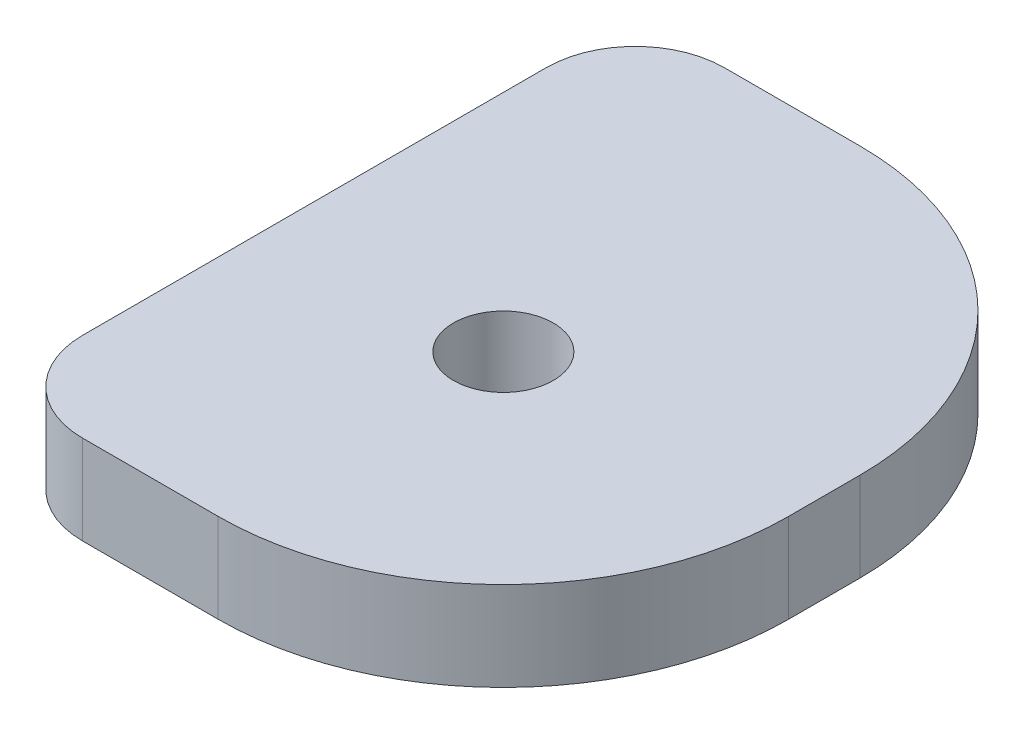
ISO-10303-21;
HEADER;
FILE_DESCRIPTION(('STEP AP214'),'2;1');
FILE_NAME('part.step','',(''),(''),'','','');
FILE_SCHEMA(('AUTOMOTIVE_DESIGN { 1 0 10303 214 1 1 1 1 }'));
ENDSEC;
DATA;
#1=APPLICATION_CONTEXT('core data for automotive mechanical design processes');
#2=APPLICATION_PROTOCOL_DEFINITION('international standard','automotive_design',2000,#1);
#3=PRODUCT_CONTEXT('',#1,'mechanical');
#4=PRODUCT('Part','Part','',(#3));
#5=PRODUCT_RELATED_PRODUCT_CATEGORY('part','',(#4));
#6=PRODUCT_DEFINITION_FORMATION('','',#4);
#7=PRODUCT_DEFINITION_CONTEXT('part definition',#1,'design');
#8=PRODUCT_DEFINITION('design','',#6,#7);
#9=PRODUCT_DEFINITION_SHAPE('','',#8);
#10=(LENGTH_UNIT() NAMED_UNIT(*) SI_UNIT(.MILLI.,.METRE.));
#11=(NAMED_UNIT(*) PLANE_ANGLE_UNIT() SI_UNIT($,.RADIAN.));
#12=(NAMED_UNIT(*) SI_UNIT($,.STERADIAN.) SOLID_ANGLE_UNIT());
#13=UNCERTAINTY_MEASURE_WITH_UNIT(LENGTH_MEASURE(1.E-05),#10,'distance_accuracy_value','');
#14=(GEOMETRIC_REPRESENTATION_CONTEXT(3) GLOBAL_UNCERTAINTY_ASSIGNED_CONTEXT((#13)) GLOBAL_UNIT_ASSIGNED_CONTEXT((#10,
#11,#12)) REPRESENTATION_CONTEXT('',''));
#15=CARTESIAN_POINT('',(0.,0.,0.));
#16=DIRECTION('',(0.,0.,1.));
#17=DIRECTION('',(1.,0.,0.));
#18=AXIS2_PLACEMENT_3D('',#15,#16,#17);
#19=CARTESIAN_POINT('',(-25.4,3.175,11.43));
#20=DIRECTION('',(0.,0.,-1.));
#21=DIRECTION('',(-1.,0.,0.));
#22=AXIS2_PLACEMENT_3D('',#19,#20,#21);
#23=PLANE('',#22);
#24=DIRECTION('',(1.,0.,0.));
#25=VECTOR('',#24,1.);
#26=CARTESIAN_POINT('',(-25.4,3.175,11.43));
#27=LINE('',#26,#25);
#28=CARTESIAN_POINT('',(10.414,3.175,11.43));
#29=VERTEX_POINT('',#28);
#30=CARTESIAN_POINT('',(15.24,3.175,11.43));
#31=VERTEX_POINT('',#30);
#32=EDGE_CURVE('E164',#29,#31,#27,.T.);
#33=ORIENTED_EDGE('',*,*,#32,.F.);
#34=DIRECTION('',(0.,1.,0.));
#35=VECTOR('',#34,1.);
#36=CARTESIAN_POINT('',(10.414,3.175,11.43));
#37=LINE('',#36,#35);
#38=CARTESIAN_POINT('',(10.414,0.,11.43));
#39=VERTEX_POINT('',#38);
#40=EDGE_CURVE('E55',#29,#39,#37,.F.);
#41=ORIENTED_EDGE('',*,*,#40,.T.);
#42=DIRECTION('',(1.,0.,0.));
#43=VECTOR('',#42,1.);
#44=CARTESIAN_POINT('',(-25.4,0.,11.43));
#45=LINE('',#44,#43);
#46=CARTESIAN_POINT('',(15.24,0.,11.43));
#47=VERTEX_POINT('',#46);
#48=EDGE_CURVE('E98',#39,#47,#45,.T.);
#49=ORIENTED_EDGE('',*,*,#48,.T.);
#50=DIRECTION('',(0.,-1.,0.));
#51=VECTOR('',#50,1.);
#52=CARTESIAN_POINT('',(15.24,3.175,11.43));
#53=LINE('',#52,#51);
#54=EDGE_CURVE('E101',#47,#31,#53,.F.);
#55=ORIENTED_EDGE('',*,*,#54,.T.);
#56=EDGE_LOOP('',(#33,#41,#49,#55));
#57=FACE_BOUND('',#56,.T.);
#58=ADVANCED_FACE('F32',(#57),#23,.F.);
#59=CARTESIAN_POINT('',(25.4,3.175,-11.43));
#60=DIRECTION('',(-1.,0.,0.));
#61=DIRECTION('',(0.,0.,1.));
#62=AXIS2_PLACEMENT_3D('',#59,#60,#61);
#63=PLANE('',#62);
#64=DIRECTION('',(0.,0.,-1.));
#65=VECTOR('',#64,1.);
#66=CARTESIAN_POINT('',(25.4,0.,-11.43));
#67=LINE('',#66,#65);
#68=CARTESIAN_POINT('',(25.4,0.,1.27));
#69=VERTEX_POINT('',#68);
#70=CARTESIAN_POINT('',(25.4,0.,-1.27));
#71=VERTEX_POINT('',#70);
#72=EDGE_CURVE('E104',#69,#71,#67,.T.);
#73=ORIENTED_EDGE('',*,*,#72,.T.);
#74=DIRECTION('',(0.,-1.,0.));
#75=VECTOR('',#74,1.);
#76=CARTESIAN_POINT('',(25.4,3.175,-1.27));
#77=LINE('',#76,#75);
#78=CARTESIAN_POINT('',(25.4,3.175,-1.27));
#79=VERTEX_POINT('',#78);
#80=EDGE_CURVE('E136',#71,#79,#77,.F.);
#81=ORIENTED_EDGE('',*,*,#80,.T.);
#82=DIRECTION('',(0.,0.,-1.));
#83=VECTOR('',#82,1.);
#84=CARTESIAN_POINT('',(25.4,3.175,-11.43));
#85=LINE('',#84,#83);
#86=CARTESIAN_POINT('',(25.4,3.175,1.27));
#87=VERTEX_POINT('',#86);
#88=EDGE_CURVE('E120',#87,#79,#85,.T.);
#89=ORIENTED_EDGE('',*,*,#88,.F.);
#90=DIRECTION('',(0.,-1.,0.));
#91=VECTOR('',#90,1.);
#92=CARTESIAN_POINT('',(25.4,3.175,1.27));
#93=LINE('',#92,#91);
#94=EDGE_CURVE('E127',#87,#69,#93,.T.);
#95=ORIENTED_EDGE('',*,*,#94,.T.);
#96=EDGE_LOOP('',(#73,#81,#89,#95));
#97=FACE_BOUND('',#96,.T.);
#98=ADVANCED_FACE('F172',(#97),#63,.F.);
#99=CARTESIAN_POINT('',(-25.4,3.175,-11.43));
#100=DIRECTION('',(0.,0.,1.));
#101=DIRECTION('',(1.,0.,0.));
#102=AXIS2_PLACEMENT_3D('',#99,#100,#101);
#103=PLANE('',#102);
#104=DIRECTION('',(-1.,0.,0.));
#105=VECTOR('',#104,1.);
#106=CARTESIAN_POINT('',(-25.4,0.,-11.43));
#107=LINE('',#106,#105);
#108=CARTESIAN_POINT('',(15.24,0.,-11.43));
#109=VERTEX_POINT('',#108);
#110=CARTESIAN_POINT('',(10.414,0.,-11.43));
#111=VERTEX_POINT('',#110);
#112=EDGE_CURVE('E123',#109,#111,#107,.T.);
#113=ORIENTED_EDGE('',*,*,#112,.T.);
#114=DIRECTION('',(0.,1.,0.));
#115=VECTOR('',#114,1.);
#116=CARTESIAN_POINT('',(10.414,3.175,-11.43));
#117=LINE('',#116,#115);
#118=CARTESIAN_POINT('',(10.414,3.175,-11.43));
#119=VERTEX_POINT('',#118);
#120=EDGE_CURVE('E11',#111,#119,#117,.T.);
#121=ORIENTED_EDGE('',*,*,#120,.T.);
#122=DIRECTION('',(-1.,0.,0.));
#123=VECTOR('',#122,1.);
#124=CARTESIAN_POINT('',(-25.4,3.175,-11.43));
#125=LINE('',#124,#123);
#126=CARTESIAN_POINT('',(15.24,3.175,-11.43));
#127=VERTEX_POINT('',#126);
#128=EDGE_CURVE('E117',#127,#119,#125,.T.);
#129=ORIENTED_EDGE('',*,*,#128,.F.);
#130=DIRECTION('',(0.,-1.,0.));
#131=VECTOR('',#130,1.);
#132=CARTESIAN_POINT('',(15.24,3.175,-11.43));
#133=LINE('',#132,#131);
#134=EDGE_CURVE('E131',#127,#109,#133,.T.);
#135=ORIENTED_EDGE('',*,*,#134,.T.);
#136=EDGE_LOOP('',(#113,#121,#129,#135));
#137=FACE_BOUND('',#136,.T.);
#138=ADVANCED_FACE('F180',(#137),#103,.F.);
#139=CARTESIAN_POINT('',(0.,3.175,0.));
#140=DIRECTION('',(0.,1.,0.));
#141=DIRECTION('',(0.,0.,1.));
#142=AXIS2_PLACEMENT_3D('',#139,#140,#141);
#143=PLANE('',#142);
#144=DIRECTION('',(0.,0.,-1.));
#145=VECTOR('',#144,1.);
#146=CARTESIAN_POINT('',(7.23899999999999,3.175,-11.43));
#147=LINE('',#146,#145);
#148=CARTESIAN_POINT('',(7.239,3.175,8.255));
#149=VERTEX_POINT('',#148);
#150=CARTESIAN_POINT('',(7.23899999999999,3.175,-8.255));
#151=VERTEX_POINT('',#150);
#152=EDGE_CURVE('E158',#149,#151,#147,.T.);
#153=ORIENTED_EDGE('',*,*,#152,.F.);
#154=CARTESIAN_POINT('',(10.414,3.175,8.255));
#155=DIRECTION('',(0.,1.,0.));
#156=DIRECTION('',(0.,0.,1.));
#157=AXIS2_PLACEMENT_3D('',#154,#155,#156);
#158=CIRCLE('',#157,3.175);
#159=EDGE_CURVE('E145',#149,#29,#158,.T.);
#160=ORIENTED_EDGE('',*,*,#159,.T.);
#161=ORIENTED_EDGE('',*,*,#32,.T.);
#162=CARTESIAN_POINT('',(15.24,3.175,1.27));
#163=DIRECTION('',(0.,1.,0.));
#164=DIRECTION('',(0.,0.,1.));
#165=AXIS2_PLACEMENT_3D('',#162,#163,#164);
#166=CIRCLE('',#165,10.16);
#167=EDGE_CURVE('E114',#31,#87,#166,.T.);
#168=ORIENTED_EDGE('',*,*,#167,.T.);
#169=ORIENTED_EDGE('',*,*,#88,.T.);
#170=CARTESIAN_POINT('',(15.24,3.175,-1.27));
#171=DIRECTION('',(0.,1.,0.));
#172=DIRECTION('',(0.,0.,1.));
#173=AXIS2_PLACEMENT_3D('',#170,#171,#172);
#174=CIRCLE('',#173,10.16);
#175=EDGE_CURVE('E134',#79,#127,#174,.T.);
#176=ORIENTED_EDGE('',*,*,#175,.T.);
#177=ORIENTED_EDGE('',*,*,#128,.T.);
#178=CARTESIAN_POINT('',(10.414,3.175,-8.255));
#179=DIRECTION('',(0.,1.,0.));
#180=DIRECTION('',(0.,0.,1.));
#181=AXIS2_PLACEMENT_3D('',#178,#179,#180);
#182=CIRCLE('',#181,3.175);
#183=EDGE_CURVE('E143',#119,#151,#182,.T.);
#184=ORIENTED_EDGE('',*,*,#183,.T.);
#185=EDGE_LOOP('',(#153,#160,#161,#168,#169,#176,#177,#184));
#186=FACE_BOUND('',#185,.T.);
#187=CARTESIAN_POINT('',(15.24,3.175,1.27));
#188=DIRECTION('',(0.,1.,0.));
#189=DIRECTION('',(0.,0.,1.));
#190=AXIS2_PLACEMENT_3D('',#187,#188,#189);
#191=CIRCLE('',#190,1.778);
#192=CARTESIAN_POINT('',(15.24,3.175,3.048));
#193=VERTEX_POINT('',#192);
#194=EDGE_CURVE('E157',#193,#193,#191,.T.);
#195=ORIENTED_EDGE('',*,*,#194,.F.);
#196=EDGE_LOOP('',(#195));
#197=FACE_BOUND('',#196,.T.);
#198=ADVANCED_FACE('F162',(#186,#197),#143,.T.);
#199=CARTESIAN_POINT('',(0.,0.,0.));
#200=DIRECTION('',(0.,1.,0.));
#201=DIRECTION('',(0.,0.,1.));
#202=AXIS2_PLACEMENT_3D('',#199,#200,#201);
#203=PLANE('',#202);
#204=CARTESIAN_POINT('',(15.24,0.,1.27));
#205=DIRECTION('',(0.,1.,0.));
#206=DIRECTION('',(0.,0.,1.));
#207=AXIS2_PLACEMENT_3D('',#204,#205,#206);
#208=CIRCLE('',#207,1.778);
#209=CARTESIAN_POINT('',(15.24,0.,3.048));
#210=VERTEX_POINT('',#209);
#211=EDGE_CURVE('E105',#210,#210,#208,.T.);
#212=ORIENTED_EDGE('',*,*,#211,.T.);
#213=EDGE_LOOP('',(#212));
#214=FACE_BOUND('',#213,.T.);
#215=ORIENTED_EDGE('',*,*,#48,.F.);
#216=CARTESIAN_POINT('',(10.414,0.,8.255));
#217=DIRECTION('',(0.,1.,0.));
#218=DIRECTION('',(0.,0.,1.));
#219=AXIS2_PLACEMENT_3D('',#216,#217,#218);
#220=CIRCLE('',#219,3.175);
#221=CARTESIAN_POINT('',(7.239,0.,8.255));
#222=VERTEX_POINT('',#221);
#223=EDGE_CURVE('E40',#39,#222,#220,.F.);
#224=ORIENTED_EDGE('',*,*,#223,.T.);
#225=DIRECTION('',(0.,0.,-1.));
#226=VECTOR('',#225,1.);
#227=CARTESIAN_POINT('',(7.23899999999999,0.,-11.43));
#228=LINE('',#227,#226);
#229=CARTESIAN_POINT('',(7.23899999999999,0.,-8.255));
#230=VERTEX_POINT('',#229);
#231=EDGE_CURVE('E149',#222,#230,#228,.T.);
#232=ORIENTED_EDGE('',*,*,#231,.T.);
#233=CARTESIAN_POINT('',(10.414,0.,-8.255));
#234=DIRECTION('',(0.,1.,0.));
#235=DIRECTION('',(0.,0.,1.));
#236=AXIS2_PLACEMENT_3D('',#233,#234,#235);
#237=CIRCLE('',#236,3.175);
#238=EDGE_CURVE('E47',#230,#111,#237,.F.);
#239=ORIENTED_EDGE('',*,*,#238,.T.);
#240=ORIENTED_EDGE('',*,*,#112,.F.);
#241=CARTESIAN_POINT('',(15.24,0.,-1.27));
#242=DIRECTION('',(0.,1.,0.));
#243=DIRECTION('',(0.,0.,1.));
#244=AXIS2_PLACEMENT_3D('',#241,#242,#243);
#245=CIRCLE('',#244,10.16);
#246=EDGE_CURVE('E129',#109,#71,#245,.F.);
#247=ORIENTED_EDGE('',*,*,#246,.T.);
#248=ORIENTED_EDGE('',*,*,#72,.F.);
#249=CARTESIAN_POINT('',(15.24,0.,1.27));
#250=DIRECTION('',(0.,1.,0.));
#251=DIRECTION('',(0.,0.,1.));
#252=AXIS2_PLACEMENT_3D('',#249,#250,#251);
#253=CIRCLE('',#252,10.16);
#254=EDGE_CURVE('E108',#69,#47,#253,.F.);
#255=ORIENTED_EDGE('',*,*,#254,.T.);
#256=EDGE_LOOP('',(#215,#224,#232,#239,#240,#247,#248,#255));
#257=FACE_BOUND('',#256,.T.);
#258=ADVANCED_FACE('F109',(#214,#257),#203,.F.);
#259=CARTESIAN_POINT('',(15.24,3.175,1.27));
#260=DIRECTION('',(0.,-1.,0.));
#261=DIRECTION('',(0.,0.,-1.));
#262=AXIS2_PLACEMENT_3D('',#259,#260,#261);
#263=CYLINDRICAL_SURFACE('',#262,10.16);
#264=ORIENTED_EDGE('',*,*,#167,.F.);
#265=ORIENTED_EDGE('',*,*,#54,.F.);
#266=ORIENTED_EDGE('',*,*,#254,.F.);
#267=ORIENTED_EDGE('',*,*,#94,.F.);
#268=EDGE_LOOP('',(#264,#265,#266,#267));
#269=FACE_BOUND('',#268,.T.);
#270=ADVANCED_FACE('F116',(#269),#263,.T.);
#271=CARTESIAN_POINT('',(15.24,0.,1.27));
#272=DIRECTION('',(0.,1.,0.));
#273=DIRECTION('',(0.,0.,1.));
#274=AXIS2_PLACEMENT_3D('',#271,#272,#273);
#275=CYLINDRICAL_SURFACE('',#274,1.778);
#276=ORIENTED_EDGE('',*,*,#211,.F.);
#277=EDGE_LOOP('',(#276));
#278=FACE_BOUND('',#277,.T.);
#279=ORIENTED_EDGE('',*,*,#194,.T.);
#280=EDGE_LOOP('',(#279));
#281=FACE_BOUND('',#280,.T.);
#282=ADVANCED_FACE('F190',(#278,#281),#275,.F.);
#283=CARTESIAN_POINT('',(15.24,3.175,-1.27));
#284=DIRECTION('',(0.,-1.,0.));
#285=DIRECTION('',(0.,0.,-1.));
#286=AXIS2_PLACEMENT_3D('',#283,#284,#285);
#287=CYLINDRICAL_SURFACE('',#286,10.16);
#288=ORIENTED_EDGE('',*,*,#175,.F.);
#289=ORIENTED_EDGE('',*,*,#80,.F.);
#290=ORIENTED_EDGE('',*,*,#246,.F.);
#291=ORIENTED_EDGE('',*,*,#134,.F.);
#292=EDGE_LOOP('',(#288,#289,#290,#291));
#293=FACE_BOUND('',#292,.T.);
#294=ADVANCED_FACE('F176',(#293),#287,.T.);
#295=CARTESIAN_POINT('',(7.23899999999999,0.,-11.43));
#296=DIRECTION('',(1.,0.,0.));
#297=DIRECTION('',(0.,0.,-1.));
#298=AXIS2_PLACEMENT_3D('',#295,#296,#297);
#299=PLANE('',#298);
#300=ORIENTED_EDGE('',*,*,#231,.F.);
#301=DIRECTION('',(0.,1.,0.));
#302=VECTOR('',#301,1.);
#303=CARTESIAN_POINT('',(7.239,0.,8.255));
#304=LINE('',#303,#302);
#305=EDGE_CURVE('E140',#222,#149,#304,.T.);
#306=ORIENTED_EDGE('',*,*,#305,.T.);
#307=ORIENTED_EDGE('',*,*,#152,.T.);
#308=DIRECTION('',(0.,1.,0.));
#309=VECTOR('',#308,1.);
#310=CARTESIAN_POINT('',(7.23899999999999,0.,-8.255));
#311=LINE('',#310,#309);
#312=EDGE_CURVE('E138',#151,#230,#311,.F.);
#313=ORIENTED_EDGE('',*,*,#312,.T.);
#314=EDGE_LOOP('',(#300,#306,#307,#313));
#315=FACE_BOUND('',#314,.T.);
#316=ADVANCED_FACE('F153',(#315),#299,.F.);
#317=CARTESIAN_POINT('',(10.414,0.,8.255));
#318=DIRECTION('',(0.,1.,0.));
#319=DIRECTION('',(0.,0.,1.));
#320=AXIS2_PLACEMENT_3D('',#317,#318,#319);
#321=CYLINDRICAL_SURFACE('',#320,3.175);
#322=ORIENTED_EDGE('',*,*,#223,.F.);
#323=ORIENTED_EDGE('',*,*,#40,.F.);
#324=ORIENTED_EDGE('',*,*,#159,.F.);
#325=ORIENTED_EDGE('',*,*,#305,.F.);
#326=EDGE_LOOP('',(#322,#323,#324,#325));
#327=FACE_BOUND('',#326,.T.);
#328=ADVANCED_FACE('F160',(#327),#321,.T.);
#329=CARTESIAN_POINT('',(10.414,3.175,-8.255));
#330=DIRECTION('',(0.,1.,0.));
#331=DIRECTION('',(0.,0.,1.));
#332=AXIS2_PLACEMENT_3D('',#329,#330,#331);
#333=CYLINDRICAL_SURFACE('',#332,3.175);
#334=ORIENTED_EDGE('',*,*,#238,.F.);
#335=ORIENTED_EDGE('',*,*,#312,.F.);
#336=ORIENTED_EDGE('',*,*,#183,.F.);
#337=ORIENTED_EDGE('',*,*,#120,.F.);
#338=EDGE_LOOP('',(#334,#335,#336,#337));
#339=FACE_BOUND('',#338,.T.);
#340=ADVANCED_FACE('F34',(#339),#333,.T.);
#341=CLOSED_SHELL('',(#58,#98,#138,#198,#258,#270,#282,#294,#316,#328,#340));
#342=MANIFOLD_SOLID_BREP('B2',#341);
#343=ADVANCED_BREP_SHAPE_REPRESENTATION('',(#18,#342),#14);
#344=SHAPE_DEFINITION_REPRESENTATION(#9,#343);
ENDSEC;
END-ISO-10303-21;
